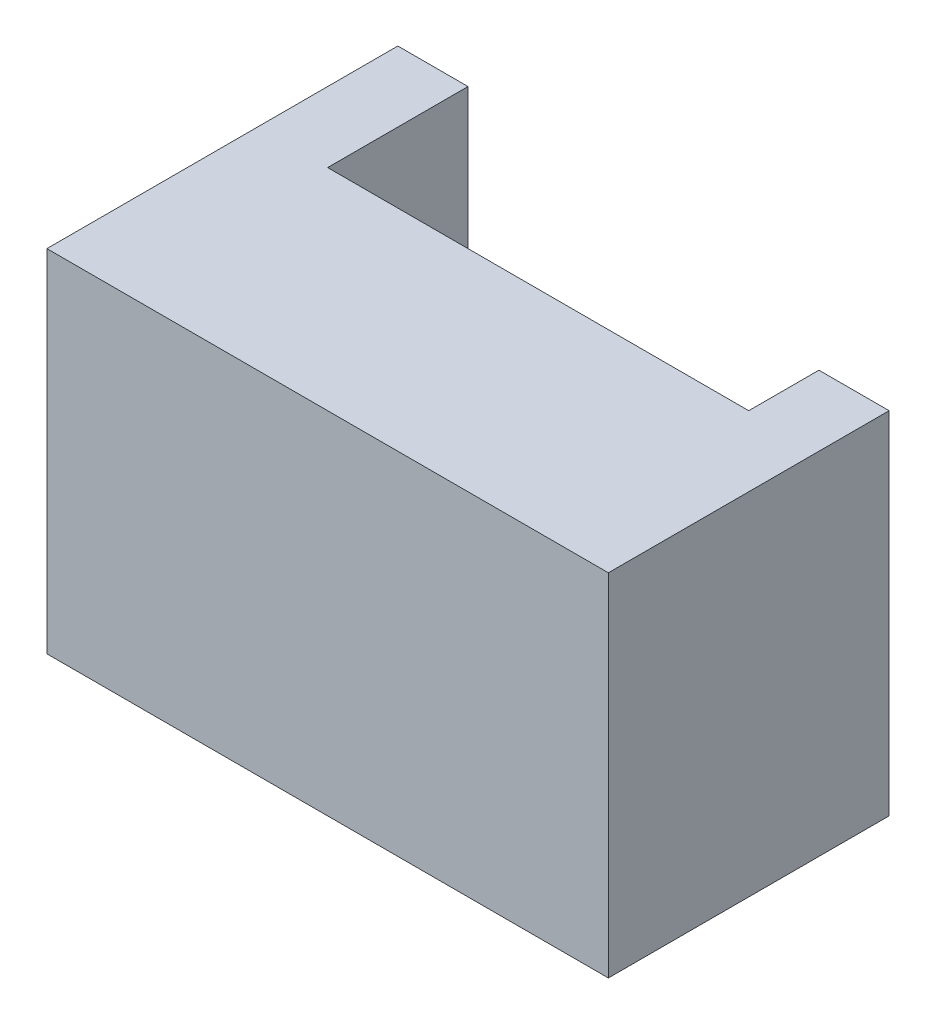
ISO-10303-21;
HEADER;
FILE_DESCRIPTION(('STEP AP214'),'2;1');
FILE_NAME('part.step','',(''),(''),'','','');
FILE_SCHEMA(('AUTOMOTIVE_DESIGN { 1 0 10303 214 1 1 1 1 }'));
ENDSEC;
DATA;
#1=APPLICATION_CONTEXT('core data for automotive mechanical design processes');
#2=APPLICATION_PROTOCOL_DEFINITION('international standard','automotive_design',2000,#1);
#3=PRODUCT_CONTEXT('',#1,'mechanical');
#4=PRODUCT('Part','Part','',(#3));
#5=PRODUCT_RELATED_PRODUCT_CATEGORY('part','',(#4));
#6=PRODUCT_DEFINITION_FORMATION('','',#4);
#7=PRODUCT_DEFINITION_CONTEXT('part definition',#1,'design');
#8=PRODUCT_DEFINITION('design','',#6,#7);
#9=PRODUCT_DEFINITION_SHAPE('','',#8);
#10=(LENGTH_UNIT() NAMED_UNIT(*) SI_UNIT(.MILLI.,.METRE.));
#11=(NAMED_UNIT(*) PLANE_ANGLE_UNIT() SI_UNIT($,.RADIAN.));
#12=(NAMED_UNIT(*) SI_UNIT($,.STERADIAN.) SOLID_ANGLE_UNIT());
#13=UNCERTAINTY_MEASURE_WITH_UNIT(LENGTH_MEASURE(1.E-05),#10,'distance_accuracy_value','');
#14=(GEOMETRIC_REPRESENTATION_CONTEXT(3) GLOBAL_UNCERTAINTY_ASSIGNED_CONTEXT((#13)) GLOBAL_UNIT_ASSIGNED_CONTEXT((#10,
#11,#12)) REPRESENTATION_CONTEXT('',''));
#15=CARTESIAN_POINT('',(0.,0.,0.));
#16=DIRECTION('',(0.,0.,1.));
#17=DIRECTION('',(1.,0.,0.));
#18=AXIS2_PLACEMENT_3D('',#15,#16,#17);
#19=CARTESIAN_POINT('',(78.7261146496815,100.,-15.4140127388535));
#20=DIRECTION('',(-1.,0.,0.));
#21=DIRECTION('',(0.,0.,1.));
#22=AXIS2_PLACEMENT_3D('',#19,#20,#21);
#23=PLANE('',#22);
#24=DIRECTION('',(0.,0.,-1.));
#25=VECTOR('',#24,1.);
#26=CARTESIAN_POINT('',(78.7261146496815,0.,-15.4140127388535));
#27=LINE('',#26,#25);
#28=CARTESIAN_POINT('',(78.7261146496816,0.,64.5859872611465));
#29=VERTEX_POINT('',#28);
#30=CARTESIAN_POINT('',(78.7261146496815,0.,-15.4140127388535));
#31=VERTEX_POINT('',#30);
#32=EDGE_CURVE('E140',#29,#31,#27,.T.);
#33=ORIENTED_EDGE('',*,*,#32,.T.);
#34=DIRECTION('',(0.,-1.,0.));
#35=VECTOR('',#34,1.);
#36=CARTESIAN_POINT('',(78.7261146496815,100.,-15.4140127388535));
#37=LINE('',#36,#35);
#38=CARTESIAN_POINT('',(78.7261146496815,100.,-15.4140127388535));
#39=VERTEX_POINT('',#38);
#40=EDGE_CURVE('E11',#39,#31,#37,.T.);
#41=ORIENTED_EDGE('',*,*,#40,.F.);
#42=DIRECTION('',(0.,0.,-1.));
#43=VECTOR('',#42,1.);
#44=CARTESIAN_POINT('',(78.7261146496815,100.,-15.4140127388535));
#45=LINE('',#44,#43);
#46=CARTESIAN_POINT('',(78.7261146496816,100.,64.5859872611465));
#47=VERTEX_POINT('',#46);
#48=EDGE_CURVE('E162',#47,#39,#45,.T.);
#49=ORIENTED_EDGE('',*,*,#48,.F.);
#50=DIRECTION('',(0.,-1.,0.));
#51=VECTOR('',#50,1.);
#52=CARTESIAN_POINT('',(78.7261146496816,100.,64.5859872611465));
#53=LINE('',#52,#51);
#54=EDGE_CURVE('E136',#47,#29,#53,.T.);
#55=ORIENTED_EDGE('',*,*,#54,.T.);
#56=EDGE_LOOP('',(#33,#41,#49,#55));
#57=FACE_BOUND('',#56,.T.);
#58=ADVANCED_FACE('F39',(#57),#23,.F.);
#59=CARTESIAN_POINT('',(58.7261146496815,100.,-15.4140127388535));
#60=DIRECTION('',(0.,0.,1.));
#61=DIRECTION('',(1.,0.,0.));
#62=AXIS2_PLACEMENT_3D('',#59,#60,#61);
#63=PLANE('',#62);
#64=DIRECTION('',(-1.,0.,0.));
#65=VECTOR('',#64,1.);
#66=CARTESIAN_POINT('',(58.7261146496815,0.,-15.4140127388535));
#67=LINE('',#66,#65);
#68=CARTESIAN_POINT('',(58.7261146496815,0.,-15.4140127388535));
#69=VERTEX_POINT('',#68);
#70=EDGE_CURVE('E144',#31,#69,#67,.T.);
#71=ORIENTED_EDGE('',*,*,#70,.T.);
#72=DIRECTION('',(0.,-1.,0.));
#73=VECTOR('',#72,1.);
#74=CARTESIAN_POINT('',(58.7261146496815,100.,-15.4140127388535));
#75=LINE('',#74,#73);
#76=CARTESIAN_POINT('',(58.7261146496815,100.,-15.4140127388535));
#77=VERTEX_POINT('',#76);
#78=EDGE_CURVE('E48',#77,#69,#75,.T.);
#79=ORIENTED_EDGE('',*,*,#78,.F.);
#80=DIRECTION('',(-1.,0.,0.));
#81=VECTOR('',#80,1.);
#82=CARTESIAN_POINT('',(58.7261146496815,100.,-15.4140127388535));
#83=LINE('',#82,#81);
#84=EDGE_CURVE('E99',#39,#77,#83,.T.);
#85=ORIENTED_EDGE('',*,*,#84,.F.);
#86=ORIENTED_EDGE('',*,*,#40,.T.);
#87=EDGE_LOOP('',(#71,#79,#85,#86));
#88=FACE_BOUND('',#87,.T.);
#89=ADVANCED_FACE('F208',(#88),#63,.F.);
#90=CARTESIAN_POINT('',(58.7261146496816,100.,4.58598726114647));
#91=DIRECTION('',(1.,0.,0.));
#92=DIRECTION('',(0.,0.,-1.));
#93=AXIS2_PLACEMENT_3D('',#90,#91,#92);
#94=PLANE('',#93);
#95=DIRECTION('',(0.,0.,1.));
#96=VECTOR('',#95,1.);
#97=CARTESIAN_POINT('',(58.7261146496816,0.,4.58598726114647));
#98=LINE('',#97,#96);
#99=CARTESIAN_POINT('',(58.7261146496816,0.,4.58598726114647));
#100=VERTEX_POINT('',#99);
#101=EDGE_CURVE('E147',#69,#100,#98,.T.);
#102=ORIENTED_EDGE('',*,*,#101,.T.);
#103=DIRECTION('',(0.,-1.,0.));
#104=VECTOR('',#103,1.);
#105=CARTESIAN_POINT('',(58.7261146496816,100.,4.58598726114647));
#106=LINE('',#105,#104);
#107=CARTESIAN_POINT('',(58.7261146496816,100.,4.58598726114647));
#108=VERTEX_POINT('',#107);
#109=EDGE_CURVE('E173',#108,#100,#106,.T.);
#110=ORIENTED_EDGE('',*,*,#109,.F.);
#111=DIRECTION('',(0.,0.,1.));
#112=VECTOR('',#111,1.);
#113=CARTESIAN_POINT('',(58.7261146496816,100.,4.58598726114647));
#114=LINE('',#113,#112);
#115=EDGE_CURVE('E183',#77,#108,#114,.T.);
#116=ORIENTED_EDGE('',*,*,#115,.F.);
#117=ORIENTED_EDGE('',*,*,#78,.T.);
#118=EDGE_LOOP('',(#102,#110,#116,#117));
#119=FACE_BOUND('',#118,.T.);
#120=ADVANCED_FACE('F181',(#119),#94,.F.);
#121=CARTESIAN_POINT('',(-61.2738853503184,100.,4.5859872611465));
#122=DIRECTION('',(0.,0.,1.));
#123=DIRECTION('',(1.,0.,0.));
#124=AXIS2_PLACEMENT_3D('',#121,#122,#123);
#125=PLANE('',#124);
#126=DIRECTION('',(-1.,0.,0.));
#127=VECTOR('',#126,1.);
#128=CARTESIAN_POINT('',(-61.2738853503184,0.,4.5859872611465));
#129=LINE('',#128,#127);
#130=CARTESIAN_POINT('',(-61.2738853503184,0.,4.5859872611465));
#131=VERTEX_POINT('',#130);
#132=EDGE_CURVE('E150',#100,#131,#129,.T.);
#133=ORIENTED_EDGE('',*,*,#132,.T.);
#134=DIRECTION('',(0.,-1.,0.));
#135=VECTOR('',#134,1.);
#136=CARTESIAN_POINT('',(-61.2738853503184,100.,4.5859872611465));
#137=LINE('',#136,#135);
#138=CARTESIAN_POINT('',(-61.2738853503184,100.,4.5859872611465));
#139=VERTEX_POINT('',#138);
#140=EDGE_CURVE('E169',#139,#131,#137,.T.);
#141=ORIENTED_EDGE('',*,*,#140,.F.);
#142=DIRECTION('',(-1.,0.,0.));
#143=VECTOR('',#142,1.);
#144=CARTESIAN_POINT('',(-61.2738853503184,100.,4.5859872611465));
#145=LINE('',#144,#143);
#146=EDGE_CURVE('E196',#108,#139,#145,.T.);
#147=ORIENTED_EDGE('',*,*,#146,.F.);
#148=ORIENTED_EDGE('',*,*,#109,.T.);
#149=EDGE_LOOP('',(#133,#141,#147,#148));
#150=FACE_BOUND('',#149,.T.);
#151=ADVANCED_FACE('F191',(#150),#125,.F.);
#152=CARTESIAN_POINT('',(-61.2738853503185,100.,-35.4140127388535));
#153=DIRECTION('',(-1.,0.,0.));
#154=DIRECTION('',(0.,0.,1.));
#155=AXIS2_PLACEMENT_3D('',#152,#153,#154);
#156=PLANE('',#155);
#157=DIRECTION('',(0.,0.,-1.));
#158=VECTOR('',#157,1.);
#159=CARTESIAN_POINT('',(-61.2738853503185,0.,-35.4140127388535));
#160=LINE('',#159,#158);
#161=CARTESIAN_POINT('',(-61.2738853503185,0.,-35.4140127388535));
#162=VERTEX_POINT('',#161);
#163=EDGE_CURVE('E153',#131,#162,#160,.T.);
#164=ORIENTED_EDGE('',*,*,#163,.T.);
#165=DIRECTION('',(0.,-1.,0.));
#166=VECTOR('',#165,1.);
#167=CARTESIAN_POINT('',(-61.2738853503185,100.,-35.4140127388535));
#168=LINE('',#167,#166);
#169=CARTESIAN_POINT('',(-61.2738853503185,100.,-35.4140127388535));
#170=VERTEX_POINT('',#169);
#171=EDGE_CURVE('E129',#170,#162,#168,.T.);
#172=ORIENTED_EDGE('',*,*,#171,.F.);
#173=DIRECTION('',(0.,0.,-1.));
#174=VECTOR('',#173,1.);
#175=CARTESIAN_POINT('',(-61.2738853503185,100.,-35.4140127388535));
#176=LINE('',#175,#174);
#177=EDGE_CURVE('E118',#139,#170,#176,.T.);
#178=ORIENTED_EDGE('',*,*,#177,.F.);
#179=ORIENTED_EDGE('',*,*,#140,.T.);
#180=EDGE_LOOP('',(#164,#172,#178,#179));
#181=FACE_BOUND('',#180,.T.);
#182=ADVANCED_FACE('F194',(#181),#156,.F.);
#183=CARTESIAN_POINT('',(-81.2738853503185,100.,-35.4140127388535));
#184=DIRECTION('',(0.,0.,1.));
#185=DIRECTION('',(1.,0.,0.));
#186=AXIS2_PLACEMENT_3D('',#183,#184,#185);
#187=PLANE('',#186);
#188=DIRECTION('',(-1.,0.,0.));
#189=VECTOR('',#188,1.);
#190=CARTESIAN_POINT('',(-81.2738853503185,0.,-35.4140127388535));
#191=LINE('',#190,#189);
#192=CARTESIAN_POINT('',(-81.2738853503185,0.,-35.4140127388535));
#193=VERTEX_POINT('',#192);
#194=EDGE_CURVE('E127',#162,#193,#191,.T.);
#195=ORIENTED_EDGE('',*,*,#194,.T.);
#196=DIRECTION('',(0.,-1.,0.));
#197=VECTOR('',#196,1.);
#198=CARTESIAN_POINT('',(-81.2738853503185,100.,-35.4140127388535));
#199=LINE('',#198,#197);
#200=CARTESIAN_POINT('',(-81.2738853503185,100.,-35.4140127388535));
#201=VERTEX_POINT('',#200);
#202=EDGE_CURVE('E124',#201,#193,#199,.T.);
#203=ORIENTED_EDGE('',*,*,#202,.F.);
#204=DIRECTION('',(-1.,0.,0.));
#205=VECTOR('',#204,1.);
#206=CARTESIAN_POINT('',(-81.2738853503185,100.,-35.4140127388535));
#207=LINE('',#206,#205);
#208=EDGE_CURVE('E112',#170,#201,#207,.T.);
#209=ORIENTED_EDGE('',*,*,#208,.F.);
#210=ORIENTED_EDGE('',*,*,#171,.T.);
#211=EDGE_LOOP('',(#195,#203,#209,#210));
#212=FACE_BOUND('',#211,.T.);
#213=ADVANCED_FACE('F125',(#212),#187,.F.);
#214=CARTESIAN_POINT('',(-81.2738853503185,100.,-35.4140127388535));
#215=DIRECTION('',(1.,0.,0.));
#216=DIRECTION('',(0.,0.,-1.));
#217=AXIS2_PLACEMENT_3D('',#214,#215,#216);
#218=PLANE('',#217);
#219=DIRECTION('',(0.,0.,1.));
#220=VECTOR('',#219,1.);
#221=CARTESIAN_POINT('',(-81.2738853503185,0.,-35.4140127388535));
#222=LINE('',#221,#220);
#223=CARTESIAN_POINT('',(-81.2738853503184,0.,64.5859872611465));
#224=VERTEX_POINT('',#223);
#225=EDGE_CURVE('E85',#193,#224,#222,.T.);
#226=ORIENTED_EDGE('',*,*,#225,.T.);
#227=DIRECTION('',(0.,-1.,0.));
#228=VECTOR('',#227,1.);
#229=CARTESIAN_POINT('',(-81.2738853503184,100.,64.5859872611465));
#230=LINE('',#229,#228);
#231=CARTESIAN_POINT('',(-81.2738853503184,100.,64.5859872611465));
#232=VERTEX_POINT('',#231);
#233=EDGE_CURVE('E130',#232,#224,#230,.T.);
#234=ORIENTED_EDGE('',*,*,#233,.F.);
#235=DIRECTION('',(0.,0.,1.));
#236=VECTOR('',#235,1.);
#237=CARTESIAN_POINT('',(-81.2738853503185,100.,-35.4140127388535));
#238=LINE('',#237,#236);
#239=EDGE_CURVE('E116',#201,#232,#238,.T.);
#240=ORIENTED_EDGE('',*,*,#239,.F.);
#241=ORIENTED_EDGE('',*,*,#202,.T.);
#242=EDGE_LOOP('',(#226,#234,#240,#241));
#243=FACE_BOUND('',#242,.T.);
#244=ADVANCED_FACE('F132',(#243),#218,.F.);
#245=CARTESIAN_POINT('',(-81.2738853503184,100.,64.5859872611465));
#246=DIRECTION('',(0.,0.,-1.));
#247=DIRECTION('',(-1.,0.,0.));
#248=AXIS2_PLACEMENT_3D('',#245,#246,#247);
#249=PLANE('',#248);
#250=DIRECTION('',(1.,0.,0.));
#251=VECTOR('',#250,1.);
#252=CARTESIAN_POINT('',(-81.2738853503184,0.,64.5859872611465));
#253=LINE('',#252,#251);
#254=EDGE_CURVE('E91',#224,#29,#253,.T.);
#255=ORIENTED_EDGE('',*,*,#254,.T.);
#256=ORIENTED_EDGE('',*,*,#54,.F.);
#257=DIRECTION('',(1.,0.,0.));
#258=VECTOR('',#257,1.);
#259=CARTESIAN_POINT('',(-81.2738853503184,100.,64.5859872611465));
#260=LINE('',#259,#258);
#261=EDGE_CURVE('E56',#232,#47,#260,.T.);
#262=ORIENTED_EDGE('',*,*,#261,.F.);
#263=ORIENTED_EDGE('',*,*,#233,.T.);
#264=EDGE_LOOP('',(#255,#256,#262,#263));
#265=FACE_BOUND('',#264,.T.);
#266=ADVANCED_FACE('F224',(#265),#249,.F.);
#267=CARTESIAN_POINT('',(0.,100.,0.));
#268=DIRECTION('',(0.,1.,0.));
#269=DIRECTION('',(0.,0.,1.));
#270=AXIS2_PLACEMENT_3D('',#267,#268,#269);
#271=PLANE('',#270);
#272=ORIENTED_EDGE('',*,*,#48,.T.);
#273=ORIENTED_EDGE('',*,*,#84,.T.);
#274=ORIENTED_EDGE('',*,*,#115,.T.);
#275=ORIENTED_EDGE('',*,*,#146,.T.);
#276=ORIENTED_EDGE('',*,*,#177,.T.);
#277=ORIENTED_EDGE('',*,*,#208,.T.);
#278=ORIENTED_EDGE('',*,*,#239,.T.);
#279=ORIENTED_EDGE('',*,*,#261,.T.);
#280=EDGE_LOOP('',(#272,#273,#274,#275,#276,#277,#278,#279));
#281=FACE_BOUND('',#280,.T.);
#282=ADVANCED_FACE('F114',(#281),#271,.T.);
#283=CARTESIAN_POINT('',(0.,0.,0.));
#284=DIRECTION('',(0.,1.,0.));
#285=DIRECTION('',(0.,0.,1.));
#286=AXIS2_PLACEMENT_3D('',#283,#284,#285);
#287=PLANE('',#286);
#288=ORIENTED_EDGE('',*,*,#32,.F.);
#289=ORIENTED_EDGE('',*,*,#254,.F.);
#290=ORIENTED_EDGE('',*,*,#225,.F.);
#291=ORIENTED_EDGE('',*,*,#194,.F.);
#292=ORIENTED_EDGE('',*,*,#163,.F.);
#293=ORIENTED_EDGE('',*,*,#132,.F.);
#294=ORIENTED_EDGE('',*,*,#101,.F.);
#295=ORIENTED_EDGE('',*,*,#70,.F.);
#296=EDGE_LOOP('',(#288,#289,#290,#291,#292,#293,#294,#295));
#297=FACE_BOUND('',#296,.T.);
#298=ADVANCED_FACE('F187',(#297),#287,.F.);
#299=CLOSED_SHELL('',(#58,#89,#120,#151,#182,#213,#244,#266,#282,#298));
#300=MANIFOLD_SOLID_BREP('B2',#299);
#301=ADVANCED_BREP_SHAPE_REPRESENTATION('',(#18,#300),#14);
#302=SHAPE_DEFINITION_REPRESENTATION(#9,#301);
ENDSEC;
END-ISO-10303-21;
